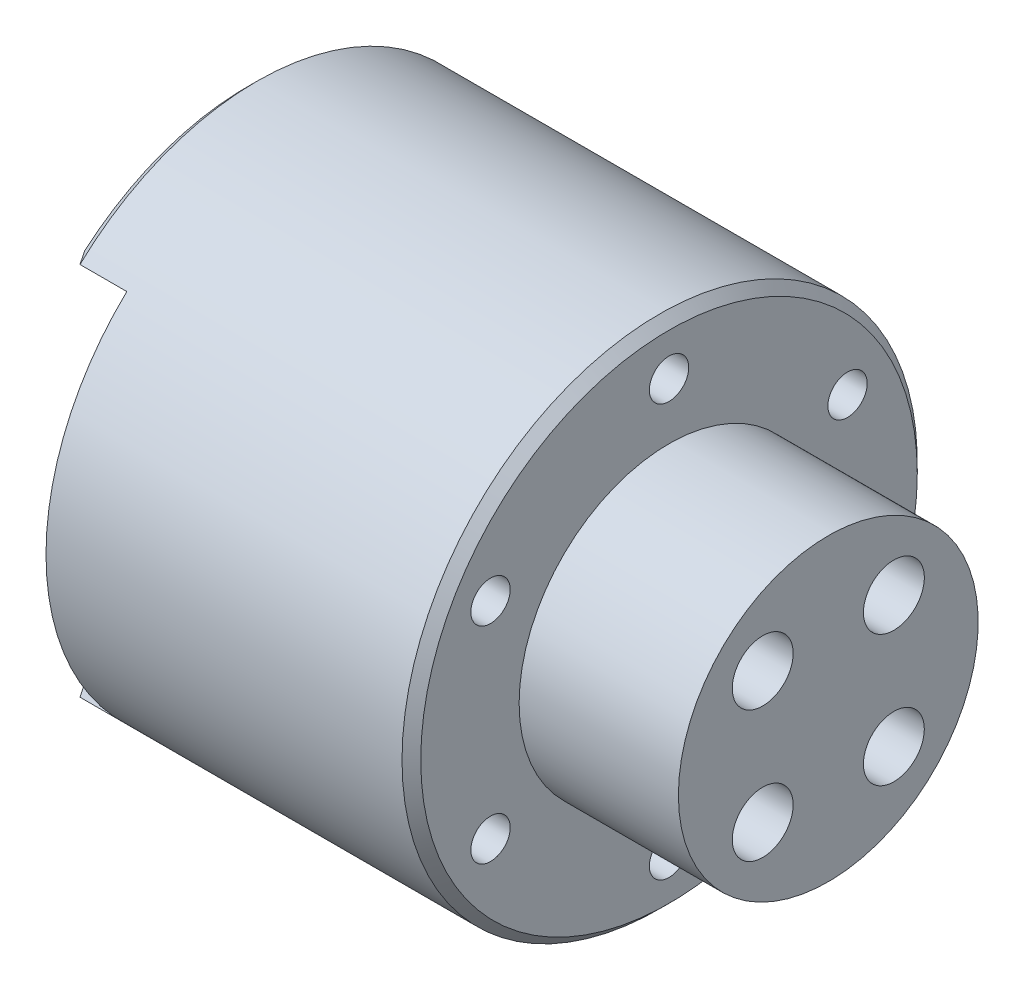
ISO-10303-21;
HEADER;
FILE_DESCRIPTION(('STEP AP214'),'2;1');
FILE_NAME('part.step','',(''),(''),'','','');
FILE_SCHEMA(('AUTOMOTIVE_DESIGN { 1 0 10303 214 1 1 1 1 }'));
ENDSEC;
DATA;
#1=APPLICATION_CONTEXT('core data for automotive mechanical design processes');
#2=APPLICATION_PROTOCOL_DEFINITION('international standard','automotive_design',2000,#1);
#3=PRODUCT_CONTEXT('',#1,'mechanical');
#4=PRODUCT('Part','Part','',(#3));
#5=PRODUCT_RELATED_PRODUCT_CATEGORY('part','',(#4));
#6=PRODUCT_DEFINITION_FORMATION('','',#4);
#7=PRODUCT_DEFINITION_CONTEXT('part definition',#1,'design');
#8=PRODUCT_DEFINITION('design','',#6,#7);
#9=PRODUCT_DEFINITION_SHAPE('','',#8);
#10=(LENGTH_UNIT() NAMED_UNIT(*) SI_UNIT(.MILLI.,.METRE.));
#11=(NAMED_UNIT(*) PLANE_ANGLE_UNIT() SI_UNIT($,.RADIAN.));
#12=(NAMED_UNIT(*) SI_UNIT($,.STERADIAN.) SOLID_ANGLE_UNIT());
#13=UNCERTAINTY_MEASURE_WITH_UNIT(LENGTH_MEASURE(1.E-05),#10,'distance_accuracy_value','');
#14=(GEOMETRIC_REPRESENTATION_CONTEXT(3) GLOBAL_UNCERTAINTY_ASSIGNED_CONTEXT((#13)) GLOBAL_UNIT_ASSIGNED_CONTEXT((#10,
#11,#12)) REPRESENTATION_CONTEXT('',''));
#15=CARTESIAN_POINT('',(0.,0.,0.));
#16=DIRECTION('',(0.,0.,1.));
#17=DIRECTION('',(1.,0.,0.));
#18=AXIS2_PLACEMENT_3D('',#15,#16,#17);
#19=CARTESIAN_POINT('',(0.,0.,0.));
#20=DIRECTION('',(1.,0.,0.));
#21=DIRECTION('',(0.,0.,-1.));
#22=AXIS2_PLACEMENT_3D('',#19,#20,#21);
#23=PLANE('',#22);
#24=CARTESIAN_POINT('',(0.,0.,0.));
#25=DIRECTION('',(1.,0.,0.));
#26=DIRECTION('',(0.,0.,-1.));
#27=AXIS2_PLACEMENT_3D('',#24,#25,#26);
#28=CIRCLE('',#27,26.5);
#29=CARTESIAN_POINT('',(0.,20.,17.3853386507137));
#30=VERTEX_POINT('',#29);
#31=CARTESIAN_POINT('',(0.,20.,-17.3853386507137));
#32=VERTEX_POINT('',#31);
#33=EDGE_CURVE('E191',#30,#32,#28,.F.);
#34=ORIENTED_EDGE('',*,*,#33,.T.);
#35=DIRECTION('',(0.,0.,-1.));
#36=VECTOR('',#35,1.);
#37=CARTESIAN_POINT('',(0.,20.,-18.8745860881769));
#38=LINE('',#37,#36);
#39=EDGE_CURVE('E115',#30,#32,#38,.T.);
#40=ORIENTED_EDGE('',*,*,#39,.F.);
#41=EDGE_LOOP('',(#34,#40));
#42=FACE_BOUND('',#41,.T.);
#43=ADVANCED_FACE('F44',(#42),#23,.F.);
#44=CARTESIAN_POINT('',(62.,7.,-7.));
#45=DIRECTION('',(-1.,0.,0.));
#46=DIRECTION('',(0.,0.,1.));
#47=AXIS2_PLACEMENT_3D('',#44,#45,#46);
#48=CYLINDRICAL_SURFACE('',#47,3.25);
#49=CARTESIAN_POINT('',(62.,7.,-7.));
#50=DIRECTION('',(-1.,0.,0.));
#51=DIRECTION('',(0.,0.,1.));
#52=AXIS2_PLACEMENT_3D('',#49,#50,#51);
#53=CIRCLE('',#52,3.25);
#54=CARTESIAN_POINT('',(62.,7.,-3.75));
#55=VERTEX_POINT('',#54);
#56=EDGE_CURVE('E177',#55,#55,#53,.T.);
#57=ORIENTED_EDGE('',*,*,#56,.F.);
#58=EDGE_LOOP('',(#57));
#59=FACE_BOUND('',#58,.T.);
#60=CARTESIAN_POINT('',(6.,7.,-7.));
#61=DIRECTION('',(-1.,0.,0.));
#62=DIRECTION('',(0.,0.,1.));
#63=AXIS2_PLACEMENT_3D('',#60,#61,#62);
#64=CIRCLE('',#63,3.25);
#65=CARTESIAN_POINT('',(6.,7.,-3.75));
#66=VERTEX_POINT('',#65);
#67=EDGE_CURVE('E134',#66,#66,#64,.F.);
#68=ORIENTED_EDGE('',*,*,#67,.F.);
#69=EDGE_LOOP('',(#68));
#70=FACE_BOUND('',#69,.T.);
#71=ADVANCED_FACE('F279',(#59,#70),#48,.F.);
#72=CARTESIAN_POINT('',(62.,7.,7.));
#73=DIRECTION('',(-1.,0.,0.));
#74=DIRECTION('',(0.,0.,1.));
#75=AXIS2_PLACEMENT_3D('',#72,#73,#74);
#76=CYLINDRICAL_SURFACE('',#75,3.25);
#77=CARTESIAN_POINT('',(62.,7.,7.));
#78=DIRECTION('',(-1.,0.,0.));
#79=DIRECTION('',(0.,0.,-1.));
#80=AXIS2_PLACEMENT_3D('',#77,#78,#79);
#81=CIRCLE('',#80,3.25);
#82=CARTESIAN_POINT('',(62.,7.,3.75));
#83=VERTEX_POINT('',#82);
#84=EDGE_CURVE('E174',#83,#83,#81,.T.);
#85=ORIENTED_EDGE('',*,*,#84,.F.);
#86=EDGE_LOOP('',(#85));
#87=FACE_BOUND('',#86,.T.);
#88=CARTESIAN_POINT('',(6.,7.,7.));
#89=DIRECTION('',(-1.,0.,0.));
#90=DIRECTION('',(0.,0.,1.));
#91=AXIS2_PLACEMENT_3D('',#88,#89,#90);
#92=CIRCLE('',#91,3.25);
#93=CARTESIAN_POINT('',(6.,7.,10.25));
#94=VERTEX_POINT('',#93);
#95=EDGE_CURVE('E131',#94,#94,#92,.F.);
#96=ORIENTED_EDGE('',*,*,#95,.F.);
#97=EDGE_LOOP('',(#96));
#98=FACE_BOUND('',#97,.T.);
#99=ADVANCED_FACE('F275',(#87,#98),#76,.F.);
#100=CARTESIAN_POINT('',(62.,-7.,7.));
#101=DIRECTION('',(-1.,0.,0.));
#102=DIRECTION('',(0.,0.,1.));
#103=AXIS2_PLACEMENT_3D('',#100,#101,#102);
#104=CYLINDRICAL_SURFACE('',#103,3.25);
#105=CARTESIAN_POINT('',(62.,-7.,7.));
#106=DIRECTION('',(-1.,0.,0.));
#107=DIRECTION('',(0.,0.,1.));
#108=AXIS2_PLACEMENT_3D('',#105,#106,#107);
#109=CIRCLE('',#108,3.25);
#110=CARTESIAN_POINT('',(62.,-7.,10.25));
#111=VERTEX_POINT('',#110);
#112=EDGE_CURVE('E178',#111,#111,#109,.T.);
#113=ORIENTED_EDGE('',*,*,#112,.F.);
#114=EDGE_LOOP('',(#113));
#115=FACE_BOUND('',#114,.T.);
#116=CARTESIAN_POINT('',(6.,-7.,7.));
#117=DIRECTION('',(-1.,0.,0.));
#118=DIRECTION('',(0.,0.,1.));
#119=AXIS2_PLACEMENT_3D('',#116,#117,#118);
#120=CIRCLE('',#119,3.25);
#121=CARTESIAN_POINT('',(6.,-7.,10.25));
#122=VERTEX_POINT('',#121);
#123=EDGE_CURVE('E128',#122,#122,#120,.F.);
#124=ORIENTED_EDGE('',*,*,#123,.F.);
#125=EDGE_LOOP('',(#124));
#126=FACE_BOUND('',#125,.T.);
#127=ADVANCED_FACE('F278',(#115,#126),#104,.F.);
#128=CARTESIAN_POINT('',(62.,-7.,-7.));
#129=DIRECTION('',(-1.,0.,0.));
#130=DIRECTION('',(0.,0.,1.));
#131=AXIS2_PLACEMENT_3D('',#128,#129,#130);
#132=CYLINDRICAL_SURFACE('',#131,3.25);
#133=CARTESIAN_POINT('',(62.,-7.,-7.));
#134=DIRECTION('',(-1.,0.,0.));
#135=DIRECTION('',(0.,0.,-1.));
#136=AXIS2_PLACEMENT_3D('',#133,#134,#135);
#137=CIRCLE('',#136,3.25);
#138=CARTESIAN_POINT('',(62.,-7.,-10.25));
#139=VERTEX_POINT('',#138);
#140=EDGE_CURVE('E171',#139,#139,#137,.T.);
#141=ORIENTED_EDGE('',*,*,#140,.F.);
#142=EDGE_LOOP('',(#141));
#143=FACE_BOUND('',#142,.T.);
#144=CARTESIAN_POINT('',(6.,-7.,-7.));
#145=DIRECTION('',(-1.,0.,0.));
#146=DIRECTION('',(0.,0.,1.));
#147=AXIS2_PLACEMENT_3D('',#144,#145,#146);
#148=CIRCLE('',#147,3.25);
#149=CARTESIAN_POINT('',(6.,-7.,-3.75));
#150=VERTEX_POINT('',#149);
#151=EDGE_CURVE('E49',#150,#150,#148,.F.);
#152=ORIENTED_EDGE('',*,*,#151,.F.);
#153=EDGE_LOOP('',(#152));
#154=FACE_BOUND('',#153,.T.);
#155=ADVANCED_FACE('F283',(#143,#154),#132,.F.);
#156=CARTESIAN_POINT('',(0.,0.,0.));
#157=DIRECTION('',(1.,0.,0.));
#158=DIRECTION('',(0.,0.,-1.));
#159=AXIS2_PLACEMENT_3D('',#156,#157,#158);
#160=CONICAL_SURFACE('',#159,26.5,0.785398163397448);
#161=CARTESIAN_POINT('',(1.00048044872167,20.,18.8752860881769));
#162=CARTESIAN_POINT('',(0.810645404918592,20.,18.5986967911016));
#163=CARTESIAN_POINT('',(0.622303325385153,20.,18.3210839345306));
#164=CARTESIAN_POINT('',(0.248907193370471,20.,17.7636402955611));
#165=CARTESIAN_POINT('',(0.0638532739791997,20.,17.4838094240473));
#166=CARTESIAN_POINT('',(-0.486083635139197,20.,16.6404859186058));
#167=CARTESIAN_POINT('',(-0.845551143544351,20.,16.0734389179388));
#168=CARTESIAN_POINT('',(-1.55169336680336,20.,14.9207363731394));
#169=CARTESIAN_POINT('',(-1.89812687730353,20.,14.3349325307337));
#170=CARTESIAN_POINT('',(-2.56875489654499,20.,13.1507649289391));
#171=CARTESIAN_POINT('',(-2.8929523721089,20.,12.5524028590879));
#172=CARTESIAN_POINT('',(-3.51977568156539,20.,11.3301013023612));
#173=CARTESIAN_POINT('',(-3.82187977308349,20.,10.705892299629));
#174=CARTESIAN_POINT('',(-4.39074912073094,20.,9.44128146220551));
#175=CARTESIAN_POINT('',(-4.65750813523416,20.,8.80087679121836));
#176=CARTESIAN_POINT('',(-5.14591890294825,20.,7.50691052301442));
#177=CARTESIAN_POINT('',(-5.36780818260502,20.,6.85343946914424));
#178=CARTESIAN_POINT('',(-5.75887969252395,20.,5.53099711855797));
#179=CARTESIAN_POINT('',(-5.92809533578745,20.,4.86203593842614));
#180=CARTESIAN_POINT('',(-6.13292313697697,20.,3.86249847285681));
#181=CARTESIAN_POINT('',(-6.19227243134055,20.,3.53668681663797));
#182=CARTESIAN_POINT('',(-6.29589712089843,20.,2.88269058747112));
#183=CARTESIAN_POINT('',(-6.34017454311901,20.,2.55450633968237));
#184=CARTESIAN_POINT('',(-6.41297202215523,20.,1.89624769901981));
#185=CARTESIAN_POINT('',(-6.44148524744739,20.,1.56617254921538));
#186=CARTESIAN_POINT('',(-6.4822532916096,20.,0.90500787427641));
#187=CARTESIAN_POINT('',(-6.49450784944087,20.,0.573918332940981));
#188=CARTESIAN_POINT('',(-6.50249807647048,20.,-0.0844792268072168));
#189=CARTESIAN_POINT('',(-6.49843052584999,20.,-0.411784864802713));
#190=CARTESIAN_POINT('',(-6.47428814234015,20.,-1.06579789625738));
#191=CARTESIAN_POINT('',(-6.45421353089501,20.,-1.39250529792998));
#192=CARTESIAN_POINT('',(-6.39838907450954,20.,-2.04457450393271));
#193=CARTESIAN_POINT('',(-6.36263916819602,20.,-2.3699363029894));
#194=CARTESIAN_POINT('',(-6.27603227622328,20.,-3.01864818419774));
#195=CARTESIAN_POINT('',(-6.22517437089313,20.,-3.34199814265869));
#196=CARTESIAN_POINT('',(-6.09597813407813,20.,-4.05893041670913));
#197=CARTESIAN_POINT('',(-6.01402652478261,20.,-4.45186441096859));
#198=CARTESIAN_POINT('',(-5.83020847837886,20.,-5.23302033240672));
#199=CARTESIAN_POINT('',(-5.72834050347915,20.,-5.62124189326691));
#200=CARTESIAN_POINT('',(-5.39550225650538,20.,-6.77830814454339));
#201=CARTESIAN_POINT('',(-5.13732552557375,20.,-7.53940665103709));
#202=CARTESIAN_POINT('',(-4.55970498051505,20.,-9.04815685625068));
#203=CARTESIAN_POINT('',(-4.23954847955722,20.,-9.79552908875287));
#204=CARTESIAN_POINT('',(-3.55322991876948,20.,-11.2684896421862));
#205=CARTESIAN_POINT('',(-3.18707527374219,20.,-11.9940814507718));
#206=CARTESIAN_POINT('',(-2.51470479060521,20.,-13.2476393746361));
#207=CARTESIAN_POINT('',(-2.21626454500624,20.,-13.7798290080722));
#208=CARTESIAN_POINT('',(-1.60268100388118,20.,-14.8344352133612));
#209=CARTESIAN_POINT('',(-1.28753857973691,20.,-15.3568522931451));
#210=CARTESIAN_POINT('',(-0.649728620482031,20.,-16.3827561959331));
#211=CARTESIAN_POINT('',(-0.327333608324186,20.,-16.8864130316215));
#212=CARTESIAN_POINT('',(0.164650016672057,20.,-17.6363001220891));
#213=CARTESIAN_POINT('',(0.330027682285184,20.,-17.8853071073708));
#214=CARTESIAN_POINT('',(0.663368272393422,20.,-18.3815759503305));
#215=CARTESIAN_POINT('',(0.831331131216373,20.,-18.6288378521072));
#216=CARTESIAN_POINT('',(1.00048044872166,20.,-18.8752860881769));
#217=B_SPLINE_CURVE_WITH_KNOTS('',3,(#161,#162,#163,#164,#165,#166,#167,#168,#169,#170,#171,
#172,#173,#174,#175,#176,#177,#178,#179,#180,#181,#182,#183,#184,#185,#186,#187,#188,#189,#190,
#191,#192,#193,#194,#195,#196,#197,#198,#199,#200,#201,#202,#203,#204,#205,#206,#207,#208,#209,
#210,#211,#212,#213,#214,#215,#216),.UNSPECIFIED.,.F.,.F.,(4,2,2,2,2,2,2,2,2,2,2,2,2,2,2,2,2,2,
2,2,2,2,2,2,2,2,2,4),(0.,1.00639589164065,2.01283242530694,4.02671281839027,6.06804755504067,
8.10910939650005,10.1886405589676,12.2685384600898,14.3371198782423,16.4043864255041,
17.3976142781071,18.3907084979975,19.3842327454608,20.3777729441224,21.3593711764219,
22.3409558293714,23.3225443255342,24.3041925862929,25.5077633027697,26.711426986622,
29.1192034963619,31.5565150509502,33.9934342190533,35.8235923434605,37.6536550791369,
39.4474846475128,40.3442366308418,41.2409658712831),.UNSPECIFIED.);
#218=CARTESIAN_POINT('',(0.999999999999984,20.,18.8745860881769));
#219=VERTEX_POINT('',#218);
#220=EDGE_CURVE('E11',#219,#30,#217,.T.);
#221=ORIENTED_EDGE('',*,*,#220,.F.);
#222=CARTESIAN_POINT('',(0.999999999999984,0.,0.));
#223=DIRECTION('',(1.,0.,0.));
#224=DIRECTION('',(0.,0.,-1.));
#225=AXIS2_PLACEMENT_3D('',#222,#223,#224);
#226=CIRCLE('',#225,27.5);
#227=CARTESIAN_POINT('',(0.999999999999984,20.,-18.8745860881769));
#228=VERTEX_POINT('',#227);
#229=EDGE_CURVE('E198',#228,#219,#226,.T.);
#230=ORIENTED_EDGE('',*,*,#229,.F.);
#231=EDGE_CURVE('E54',#32,#228,#217,.T.);
#232=ORIENTED_EDGE('',*,*,#231,.F.);
#233=ORIENTED_EDGE('',*,*,#33,.F.);
#234=EDGE_LOOP('',(#221,#230,#232,#233));
#235=FACE_BOUND('',#234,.T.);
#236=ADVANCED_FACE('F287',(#235),#160,.T.);
#237=CARTESIAN_POINT('',(0.,-20.,-17.3853386507137));
#238=VERTEX_POINT('',#237);
#239=CARTESIAN_POINT('',(0.,-20.,17.3853386507137));
#240=VERTEX_POINT('',#239);
#241=EDGE_CURVE('E192',#238,#240,#28,.F.);
#242=ORIENTED_EDGE('',*,*,#241,.T.);
#243=DIRECTION('',(0.,0.,1.));
#244=VECTOR('',#243,1.);
#245=CARTESIAN_POINT('',(0.,-20.,-18.8745860881769));
#246=LINE('',#245,#244);
#247=EDGE_CURVE('E61',#238,#240,#246,.T.);
#248=ORIENTED_EDGE('',*,*,#247,.F.);
#249=EDGE_LOOP('',(#242,#248));
#250=FACE_BOUND('',#249,.T.);
#251=ADVANCED_FACE('F304',(#250),#23,.F.);
#252=CARTESIAN_POINT('',(0.,0.,0.));
#253=DIRECTION('',(-1.,0.,0.));
#254=DIRECTION('',(0.,0.,1.));
#255=AXIS2_PLACEMENT_3D('',#252,#253,#254);
#256=CYLINDRICAL_SURFACE('',#255,27.5);
#257=CARTESIAN_POINT('',(6.,0.,0.));
#258=DIRECTION('',(-1.,0.,0.));
#259=DIRECTION('',(0.,0.,1.));
#260=AXIS2_PLACEMENT_3D('',#257,#258,#259);
#261=CIRCLE('',#260,27.5);
#262=CARTESIAN_POINT('',(6.,20.,-18.8745860881769));
#263=VERTEX_POINT('',#262);
#264=CARTESIAN_POINT('',(6.,-20.,-18.8745860881769));
#265=VERTEX_POINT('',#264);
#266=EDGE_CURVE('E106',#263,#265,#261,.T.);
#267=ORIENTED_EDGE('',*,*,#266,.F.);
#268=DIRECTION('',(-1.,0.,0.));
#269=VECTOR('',#268,1.);
#270=CARTESIAN_POINT('',(6.,20.,-18.8745860881769));
#271=LINE('',#270,#269);
#272=EDGE_CURVE('E327',#263,#228,#271,.T.);
#273=ORIENTED_EDGE('',*,*,#272,.T.);
#274=ORIENTED_EDGE('',*,*,#229,.T.);
#275=DIRECTION('',(-1.,0.,0.));
#276=VECTOR('',#275,1.);
#277=CARTESIAN_POINT('',(6.,20.,18.8745860881769));
#278=LINE('',#277,#276);
#279=CARTESIAN_POINT('',(6.,20.,18.8745860881769));
#280=VERTEX_POINT('',#279);
#281=EDGE_CURVE('E123',#280,#219,#278,.T.);
#282=ORIENTED_EDGE('',*,*,#281,.F.);
#283=CARTESIAN_POINT('',(6.,0.,0.));
#284=DIRECTION('',(-1.,0.,0.));
#285=DIRECTION('',(0.,0.,1.));
#286=AXIS2_PLACEMENT_3D('',#283,#284,#285);
#287=CIRCLE('',#286,27.5);
#288=CARTESIAN_POINT('',(6.,-20.,18.8745860881769));
#289=VERTEX_POINT('',#288);
#290=EDGE_CURVE('E105',#289,#280,#287,.T.);
#291=ORIENTED_EDGE('',*,*,#290,.F.);
#292=DIRECTION('',(-1.,0.,0.));
#293=VECTOR('',#292,1.);
#294=CARTESIAN_POINT('',(6.,-20.,18.8745860881769));
#295=LINE('',#294,#293);
#296=CARTESIAN_POINT('',(0.999999999999982,-20.,18.8745860881769));
#297=VERTEX_POINT('',#296);
#298=EDGE_CURVE('E102',#289,#297,#295,.T.);
#299=ORIENTED_EDGE('',*,*,#298,.T.);
#300=CARTESIAN_POINT('',(0.999999999999984,-20.,-18.8745860881769));
#301=VERTEX_POINT('',#300);
#302=EDGE_CURVE('E121',#297,#301,#226,.T.);
#303=ORIENTED_EDGE('',*,*,#302,.T.);
#304=DIRECTION('',(-1.,0.,0.));
#305=VECTOR('',#304,1.);
#306=CARTESIAN_POINT('',(6.,-20.,-18.8745860881769));
#307=LINE('',#306,#305);
#308=EDGE_CURVE('E99',#265,#301,#307,.T.);
#309=ORIENTED_EDGE('',*,*,#308,.F.);
#310=EDGE_LOOP('',(#267,#273,#274,#282,#291,#299,#303,#309));
#311=FACE_BOUND('',#310,.T.);
#312=CARTESIAN_POINT('',(44.,0.,0.));
#313=DIRECTION('',(-1.,0.,0.));
#314=DIRECTION('',(0.,0.,1.));
#315=AXIS2_PLACEMENT_3D('',#312,#313,#314);
#316=CIRCLE('',#315,27.5);
#317=CARTESIAN_POINT('',(44.,0.,27.5));
#318=VERTEX_POINT('',#317);
#319=EDGE_CURVE('E195',#318,#318,#316,.T.);
#320=ORIENTED_EDGE('',*,*,#319,.T.);
#321=EDGE_LOOP('',(#320));
#322=FACE_BOUND('',#321,.T.);
#323=ADVANCED_FACE('F118',(#311,#322),#256,.T.);
#324=CARTESIAN_POINT('',(45.,27.5,0.));
#325=DIRECTION('',(-1.,0.,0.));
#326=DIRECTION('',(0.,0.,1.));
#327=AXIS2_PLACEMENT_3D('',#324,#325,#326);
#328=PLANE('',#327);
#329=CARTESIAN_POINT('',(45.,0.,0.));
#330=DIRECTION('',(-1.,0.,0.));
#331=DIRECTION('',(0.,0.,1.));
#332=AXIS2_PLACEMENT_3D('',#329,#330,#331);
#333=CIRCLE('',#332,26.5);
#334=CARTESIAN_POINT('',(45.,0.,26.5));
#335=VERTEX_POINT('',#334);
#336=EDGE_CURVE('E201',#335,#335,#333,.F.);
#337=ORIENTED_EDGE('',*,*,#336,.T.);
#338=EDGE_LOOP('',(#337));
#339=FACE_BOUND('',#338,.T.);
#340=CARTESIAN_POINT('',(45.,11.0000000000002,-19.0525588832575));
#341=DIRECTION('',(1.,0.,0.));
#342=DIRECTION('',(0.,-0.866025403784433,-0.50000000000001));
#343=AXIS2_PLACEMENT_3D('',#340,#341,#342);
#344=CIRCLE('',#343,2.1);
#345=CARTESIAN_POINT('',(45.,9.18134665205291,-20.1025588832575));
#346=VERTEX_POINT('',#345);
#347=EDGE_CURVE('E137',#346,#346,#344,.T.);
#348=ORIENTED_EDGE('',*,*,#347,.F.);
#349=EDGE_LOOP('',(#348));
#350=FACE_BOUND('',#349,.T.);
#351=CARTESIAN_POINT('',(45.,-10.9999999999998,-19.0525588832577));
#352=DIRECTION('',(1.,0.,0.));
#353=DIRECTION('',(0.,-0.866025403784443,0.499999999999992));
#354=AXIS2_PLACEMENT_3D('',#351,#352,#353);
#355=CIRCLE('',#354,2.1);
#356=CARTESIAN_POINT('',(45.,-12.8186533479472,-18.0025588832578));
#357=VERTEX_POINT('',#356);
#358=EDGE_CURVE('E154',#357,#357,#355,.T.);
#359=ORIENTED_EDGE('',*,*,#358,.F.);
#360=EDGE_LOOP('',(#359));
#361=FACE_BOUND('',#360,.T.);
#362=CARTESIAN_POINT('',(45.,-22.,0.));
#363=DIRECTION('',(1.,0.,0.));
#364=DIRECTION('',(0.,0.,1.));
#365=AXIS2_PLACEMENT_3D('',#362,#363,#364);
#366=CIRCLE('',#365,2.1);
#367=CARTESIAN_POINT('',(45.,-22.,2.1));
#368=VERTEX_POINT('',#367);
#369=EDGE_CURVE('E148',#368,#368,#366,.T.);
#370=ORIENTED_EDGE('',*,*,#369,.F.);
#371=EDGE_LOOP('',(#370));
#372=FACE_BOUND('',#371,.T.);
#373=CARTESIAN_POINT('',(45.,-11.0000000000001,19.0525588832576));
#374=DIRECTION('',(1.,0.,0.));
#375=DIRECTION('',(0.,0.866025403784436,0.500000000000004));
#376=AXIS2_PLACEMENT_3D('',#373,#374,#375);
#377=CIRCLE('',#376,2.1);
#378=CARTESIAN_POINT('',(45.,-9.18134665205277,20.1025588832576));
#379=VERTEX_POINT('',#378);
#380=EDGE_CURVE('E142',#379,#379,#377,.T.);
#381=ORIENTED_EDGE('',*,*,#380,.F.);
#382=EDGE_LOOP('',(#381));
#383=FACE_BOUND('',#382,.T.);
#384=CARTESIAN_POINT('',(45.,11.,19.0525588832577));
#385=DIRECTION('',(1.,0.,0.));
#386=DIRECTION('',(0.,0.86602540378444,-0.499999999999998));
#387=AXIS2_PLACEMENT_3D('',#384,#385,#386);
#388=CIRCLE('',#387,2.1);
#389=CARTESIAN_POINT('',(45.,12.8186533479473,18.0025588832577));
#390=VERTEX_POINT('',#389);
#391=EDGE_CURVE('E141',#390,#390,#388,.T.);
#392=ORIENTED_EDGE('',*,*,#391,.F.);
#393=EDGE_LOOP('',(#392));
#394=FACE_BOUND('',#393,.T.);
#395=CARTESIAN_POINT('',(45.,22.,0.));
#396=DIRECTION('',(1.,0.,0.));
#397=DIRECTION('',(0.,0.,-1.));
#398=AXIS2_PLACEMENT_3D('',#395,#396,#397);
#399=CIRCLE('',#398,2.1);
#400=CARTESIAN_POINT('',(45.,22.,-2.1));
#401=VERTEX_POINT('',#400);
#402=EDGE_CURVE('E165',#401,#401,#399,.T.);
#403=ORIENTED_EDGE('',*,*,#402,.F.);
#404=EDGE_LOOP('',(#403));
#405=FACE_BOUND('',#404,.T.);
#406=CARTESIAN_POINT('',(45.,0.,0.));
#407=DIRECTION('',(-1.,0.,0.));
#408=DIRECTION('',(0.,0.,1.));
#409=AXIS2_PLACEMENT_3D('',#406,#407,#408);
#410=CIRCLE('',#409,16.);
#411=CARTESIAN_POINT('',(45.,0.,16.));
#412=VERTEX_POINT('',#411);
#413=EDGE_CURVE('E188',#412,#412,#410,.T.);
#414=ORIENTED_EDGE('',*,*,#413,.T.);
#415=EDGE_LOOP('',(#414));
#416=FACE_BOUND('',#415,.T.);
#417=ADVANCED_FACE('F298',(#339,#350,#361,#372,#383,#394,#405,#416),#328,.F.);
#418=CARTESIAN_POINT('',(0.,0.,0.));
#419=DIRECTION('',(-1.,0.,0.));
#420=DIRECTION('',(0.,0.,1.));
#421=AXIS2_PLACEMENT_3D('',#418,#419,#420);
#422=CYLINDRICAL_SURFACE('',#421,16.);
#423=ORIENTED_EDGE('',*,*,#413,.F.);
#424=EDGE_LOOP('',(#423));
#425=FACE_BOUND('',#424,.T.);
#426=CARTESIAN_POINT('',(62.,0.,0.));
#427=DIRECTION('',(-1.,0.,0.));
#428=DIRECTION('',(0.,0.,1.));
#429=AXIS2_PLACEMENT_3D('',#426,#427,#428);
#430=CIRCLE('',#429,16.);
#431=CARTESIAN_POINT('',(62.,0.,16.));
#432=VERTEX_POINT('',#431);
#433=EDGE_CURVE('E185',#432,#432,#430,.T.);
#434=ORIENTED_EDGE('',*,*,#433,.T.);
#435=EDGE_LOOP('',(#434));
#436=FACE_BOUND('',#435,.T.);
#437=ADVANCED_FACE('F294',(#425,#436),#422,.T.);
#438=CARTESIAN_POINT('',(62.,16.,0.));
#439=DIRECTION('',(-1.,0.,0.));
#440=DIRECTION('',(0.,0.,1.));
#441=AXIS2_PLACEMENT_3D('',#438,#439,#440);
#442=PLANE('',#441);
#443=ORIENTED_EDGE('',*,*,#140,.T.);
#444=EDGE_LOOP('',(#443));
#445=FACE_BOUND('',#444,.T.);
#446=ORIENTED_EDGE('',*,*,#112,.T.);
#447=EDGE_LOOP('',(#446));
#448=FACE_BOUND('',#447,.T.);
#449=ORIENTED_EDGE('',*,*,#84,.T.);
#450=EDGE_LOOP('',(#449));
#451=FACE_BOUND('',#450,.T.);
#452=ORIENTED_EDGE('',*,*,#56,.T.);
#453=EDGE_LOOP('',(#452));
#454=FACE_BOUND('',#453,.T.);
#455=ORIENTED_EDGE('',*,*,#433,.F.);
#456=EDGE_LOOP('',(#455));
#457=FACE_BOUND('',#456,.T.);
#458=ADVANCED_FACE('F273',(#445,#448,#451,#454,#457),#442,.F.);
#459=CARTESIAN_POINT('',(25.,22.,0.));
#460=DIRECTION('',(1.,0.,0.));
#461=DIRECTION('',(0.,0.,-1.));
#462=AXIS2_PLACEMENT_3D('',#459,#460,#461);
#463=CYLINDRICAL_SURFACE('',#462,2.1);
#464=CARTESIAN_POINT('',(25.,22.,0.));
#465=DIRECTION('',(1.,0.,0.));
#466=DIRECTION('',(0.,0.,-1.));
#467=AXIS2_PLACEMENT_3D('',#464,#465,#466);
#468=CIRCLE('',#467,2.1);
#469=CARTESIAN_POINT('',(25.,22.,-2.1));
#470=VERTEX_POINT('',#469);
#471=EDGE_CURVE('E168',#470,#470,#468,.T.);
#472=ORIENTED_EDGE('',*,*,#471,.F.);
#473=EDGE_LOOP('',(#472));
#474=FACE_BOUND('',#473,.T.);
#475=ORIENTED_EDGE('',*,*,#402,.T.);
#476=EDGE_LOOP('',(#475));
#477=FACE_BOUND('',#476,.T.);
#478=ADVANCED_FACE('F269',(#474,#477),#463,.F.);
#479=CARTESIAN_POINT('',(25.,22.,0.));
#480=DIRECTION('',(1.,0.,0.));
#481=DIRECTION('',(0.,0.,-1.));
#482=AXIS2_PLACEMENT_3D('',#479,#480,#481);
#483=PLANE('',#482);
#484=ORIENTED_EDGE('',*,*,#471,.T.);
#485=EDGE_LOOP('',(#484));
#486=FACE_BOUND('',#485,.T.);
#487=ADVANCED_FACE('F265',(#486),#483,.T.);
#488=CARTESIAN_POINT('',(25.,11.,19.0525588832577));
#489=DIRECTION('',(1.,0.,0.));
#490=DIRECTION('',(0.,0.,-1.));
#491=AXIS2_PLACEMENT_3D('',#488,#489,#490);
#492=CYLINDRICAL_SURFACE('',#491,2.1);
#493=CARTESIAN_POINT('',(25.,11.,19.0525588832577));
#494=DIRECTION('',(1.,0.,0.));
#495=DIRECTION('',(0.,0.86602540378444,-0.499999999999998));
#496=AXIS2_PLACEMENT_3D('',#493,#494,#495);
#497=CIRCLE('',#496,2.1);
#498=CARTESIAN_POINT('',(25.,12.8186533479473,18.0025588832577));
#499=VERTEX_POINT('',#498);
#500=EDGE_CURVE('E162',#499,#499,#497,.T.);
#501=ORIENTED_EDGE('',*,*,#500,.F.);
#502=EDGE_LOOP('',(#501));
#503=FACE_BOUND('',#502,.T.);
#504=ORIENTED_EDGE('',*,*,#391,.T.);
#505=EDGE_LOOP('',(#504));
#506=FACE_BOUND('',#505,.T.);
#507=ADVANCED_FACE('F261',(#503,#506),#492,.F.);
#508=CARTESIAN_POINT('',(25.,11.,19.0525588832577));
#509=DIRECTION('',(1.,0.,0.));
#510=DIRECTION('',(0.,0.86602540378444,-0.499999999999998));
#511=AXIS2_PLACEMENT_3D('',#508,#509,#510);
#512=PLANE('',#511);
#513=ORIENTED_EDGE('',*,*,#500,.T.);
#514=EDGE_LOOP('',(#513));
#515=FACE_BOUND('',#514,.T.);
#516=ADVANCED_FACE('F234',(#515),#512,.T.);
#517=CARTESIAN_POINT('',(25.,-11.0000000000001,19.0525588832576));
#518=DIRECTION('',(1.,0.,0.));
#519=DIRECTION('',(0.,0.,-1.));
#520=AXIS2_PLACEMENT_3D('',#517,#518,#519);
#521=CYLINDRICAL_SURFACE('',#520,2.1);
#522=CARTESIAN_POINT('',(25.,-11.0000000000001,19.0525588832576));
#523=DIRECTION('',(1.,0.,0.));
#524=DIRECTION('',(0.,0.866025403784436,0.500000000000004));
#525=AXIS2_PLACEMENT_3D('',#522,#523,#524);
#526=CIRCLE('',#525,2.1);
#527=CARTESIAN_POINT('',(25.,-9.18134665205277,20.1025588832576));
#528=VERTEX_POINT('',#527);
#529=EDGE_CURVE('E138',#528,#528,#526,.T.);
#530=ORIENTED_EDGE('',*,*,#529,.F.);
#531=EDGE_LOOP('',(#530));
#532=FACE_BOUND('',#531,.T.);
#533=ORIENTED_EDGE('',*,*,#380,.T.);
#534=EDGE_LOOP('',(#533));
#535=FACE_BOUND('',#534,.T.);
#536=ADVANCED_FACE('F230',(#532,#535),#521,.F.);
#537=CARTESIAN_POINT('',(25.,-11.0000000000001,19.0525588832576));
#538=DIRECTION('',(1.,0.,0.));
#539=DIRECTION('',(0.,0.866025403784436,0.500000000000004));
#540=AXIS2_PLACEMENT_3D('',#537,#538,#539);
#541=PLANE('',#540);
#542=ORIENTED_EDGE('',*,*,#529,.T.);
#543=EDGE_LOOP('',(#542));
#544=FACE_BOUND('',#543,.T.);
#545=ADVANCED_FACE('F226',(#544),#541,.T.);
#546=CARTESIAN_POINT('',(25.,-22.,0.));
#547=DIRECTION('',(1.,0.,0.));
#548=DIRECTION('',(0.,0.,-1.));
#549=AXIS2_PLACEMENT_3D('',#546,#547,#548);
#550=CYLINDRICAL_SURFACE('',#549,2.1);
#551=CARTESIAN_POINT('',(25.,-22.,0.));
#552=DIRECTION('',(1.,0.,0.));
#553=DIRECTION('',(0.,0.,1.));
#554=AXIS2_PLACEMENT_3D('',#551,#552,#553);
#555=CIRCLE('',#554,2.1);
#556=CARTESIAN_POINT('',(25.,-22.,2.1));
#557=VERTEX_POINT('',#556);
#558=EDGE_CURVE('E145',#557,#557,#555,.T.);
#559=ORIENTED_EDGE('',*,*,#558,.F.);
#560=EDGE_LOOP('',(#559));
#561=FACE_BOUND('',#560,.T.);
#562=ORIENTED_EDGE('',*,*,#369,.T.);
#563=EDGE_LOOP('',(#562));
#564=FACE_BOUND('',#563,.T.);
#565=ADVANCED_FACE('F229',(#561,#564),#550,.F.);
#566=CARTESIAN_POINT('',(25.,-22.,0.));
#567=DIRECTION('',(1.,0.,0.));
#568=DIRECTION('',(0.,0.,1.));
#569=AXIS2_PLACEMENT_3D('',#566,#567,#568);
#570=PLANE('',#569);
#571=ORIENTED_EDGE('',*,*,#558,.T.);
#572=EDGE_LOOP('',(#571));
#573=FACE_BOUND('',#572,.T.);
#574=ADVANCED_FACE('F236',(#573),#570,.T.);
#575=CARTESIAN_POINT('',(25.,-10.9999999999998,-19.0525588832577));
#576=DIRECTION('',(1.,0.,0.));
#577=DIRECTION('',(0.,0.,-1.));
#578=AXIS2_PLACEMENT_3D('',#575,#576,#577);
#579=CYLINDRICAL_SURFACE('',#578,2.1);
#580=CARTESIAN_POINT('',(25.,-10.9999999999998,-19.0525588832577));
#581=DIRECTION('',(1.,0.,0.));
#582=DIRECTION('',(0.,-0.866025403784443,0.499999999999992));
#583=AXIS2_PLACEMENT_3D('',#580,#581,#582);
#584=CIRCLE('',#583,2.1);
#585=CARTESIAN_POINT('',(25.,-12.8186533479472,-18.0025588832578));
#586=VERTEX_POINT('',#585);
#587=EDGE_CURVE('E151',#586,#586,#584,.T.);
#588=ORIENTED_EDGE('',*,*,#587,.F.);
#589=EDGE_LOOP('',(#588));
#590=FACE_BOUND('',#589,.T.);
#591=ORIENTED_EDGE('',*,*,#358,.T.);
#592=EDGE_LOOP('',(#591));
#593=FACE_BOUND('',#592,.T.);
#594=ADVANCED_FACE('F239',(#590,#593),#579,.F.);
#595=CARTESIAN_POINT('',(25.,-10.9999999999998,-19.0525588832577));
#596=DIRECTION('',(1.,0.,0.));
#597=DIRECTION('',(0.,-0.866025403784443,0.499999999999992));
#598=AXIS2_PLACEMENT_3D('',#595,#596,#597);
#599=PLANE('',#598);
#600=ORIENTED_EDGE('',*,*,#587,.T.);
#601=EDGE_LOOP('',(#600));
#602=FACE_BOUND('',#601,.T.);
#603=ADVANCED_FACE('F244',(#602),#599,.T.);
#604=CARTESIAN_POINT('',(25.,11.0000000000002,-19.0525588832575));
#605=DIRECTION('',(1.,0.,0.));
#606=DIRECTION('',(0.,0.,-1.));
#607=AXIS2_PLACEMENT_3D('',#604,#605,#606);
#608=CYLINDRICAL_SURFACE('',#607,2.1);
#609=CARTESIAN_POINT('',(25.,11.0000000000002,-19.0525588832575));
#610=DIRECTION('',(1.,0.,0.));
#611=DIRECTION('',(0.,-0.866025403784433,-0.50000000000001));
#612=AXIS2_PLACEMENT_3D('',#609,#610,#611);
#613=CIRCLE('',#612,2.1);
#614=CARTESIAN_POINT('',(25.,9.18134665205291,-20.1025588832575));
#615=VERTEX_POINT('',#614);
#616=EDGE_CURVE('E157',#615,#615,#613,.T.);
#617=ORIENTED_EDGE('',*,*,#616,.F.);
#618=EDGE_LOOP('',(#617));
#619=FACE_BOUND('',#618,.T.);
#620=ORIENTED_EDGE('',*,*,#347,.T.);
#621=EDGE_LOOP('',(#620));
#622=FACE_BOUND('',#621,.T.);
#623=ADVANCED_FACE('F247',(#619,#622),#608,.F.);
#624=CARTESIAN_POINT('',(25.,11.0000000000002,-19.0525588832575));
#625=DIRECTION('',(1.,0.,0.));
#626=DIRECTION('',(0.,-0.866025403784433,-0.50000000000001));
#627=AXIS2_PLACEMENT_3D('',#624,#625,#626);
#628=PLANE('',#627);
#629=ORIENTED_EDGE('',*,*,#616,.T.);
#630=EDGE_LOOP('',(#629));
#631=FACE_BOUND('',#630,.T.);
#632=ADVANCED_FACE('F252',(#631),#628,.T.);
#633=CARTESIAN_POINT('',(1.00048044872167,-20.,-18.8752860881769));
#634=CARTESIAN_POINT('',(0.810645404918592,-20.,-18.5986967911016));
#635=CARTESIAN_POINT('',(0.622303325385153,-20.,-18.3210839345306));
#636=CARTESIAN_POINT('',(0.248907193370471,-20.,-17.7636402955611));
#637=CARTESIAN_POINT('',(0.0638532739791997,-20.,-17.4838094240473));
#638=CARTESIAN_POINT('',(-0.486083635139197,-20.,-16.6404859186058));
#639=CARTESIAN_POINT('',(-0.845551143544351,-20.,-16.0734389179388));
#640=CARTESIAN_POINT('',(-1.55169336680336,-20.,-14.9207363731394));
#641=CARTESIAN_POINT('',(-1.89812687730353,-20.,-14.3349325307337));
#642=CARTESIAN_POINT('',(-2.56875489654499,-20.,-13.1507649289391));
#643=CARTESIAN_POINT('',(-2.8929523721089,-20.,-12.5524028590879));
#644=CARTESIAN_POINT('',(-3.51977568156539,-20.,-11.3301013023612));
#645=CARTESIAN_POINT('',(-3.82187977308349,-20.,-10.705892299629));
#646=CARTESIAN_POINT('',(-4.39074912073094,-20.,-9.44128146220551));
#647=CARTESIAN_POINT('',(-4.65750813523416,-20.,-8.80087679121836));
#648=CARTESIAN_POINT('',(-5.14591890294825,-20.,-7.50691052301442));
#649=CARTESIAN_POINT('',(-5.36780818260502,-20.,-6.85343946914424));
#650=CARTESIAN_POINT('',(-5.75887969252395,-20.,-5.53099711855797));
#651=CARTESIAN_POINT('',(-5.92809533578745,-20.,-4.86203593842614));
#652=CARTESIAN_POINT('',(-6.13292313697697,-20.,-3.86249847285681));
#653=CARTESIAN_POINT('',(-6.19227243134055,-20.,-3.53668681663797));
#654=CARTESIAN_POINT('',(-6.29589712089843,-20.,-2.88269058747112));
#655=CARTESIAN_POINT('',(-6.34017454311901,-20.,-2.55450633968237));
#656=CARTESIAN_POINT('',(-6.41297202215523,-20.,-1.89624769901981));
#657=CARTESIAN_POINT('',(-6.44148524744739,-20.,-1.56617254921538));
#658=CARTESIAN_POINT('',(-6.4822532916096,-20.,-0.90500787427641));
#659=CARTESIAN_POINT('',(-6.49450784944087,-20.,-0.573918332940981));
#660=CARTESIAN_POINT('',(-6.50249807647048,-20.,0.0844792268072167));
#661=CARTESIAN_POINT('',(-6.49843052584999,-20.,0.411784864802713));
#662=CARTESIAN_POINT('',(-6.47428814234015,-20.,1.06579789625738));
#663=CARTESIAN_POINT('',(-6.45421353089501,-20.,1.39250529792998));
#664=CARTESIAN_POINT('',(-6.39838907450954,-20.,2.04457450393271));
#665=CARTESIAN_POINT('',(-6.36263916819602,-20.,2.3699363029894));
#666=CARTESIAN_POINT('',(-6.27603227622328,-20.,3.01864818419774));
#667=CARTESIAN_POINT('',(-6.22517437089313,-20.,3.34199814265869));
#668=CARTESIAN_POINT('',(-6.09597813407813,-20.,4.05893041670913));
#669=CARTESIAN_POINT('',(-6.01402652478262,-20.,4.45186441096859));
#670=CARTESIAN_POINT('',(-5.83020847837886,-20.,5.23302033240672));
#671=CARTESIAN_POINT('',(-5.72834050347915,-20.,5.62124189326691));
#672=CARTESIAN_POINT('',(-5.39550225650537,-20.,6.77830814454339));
#673=CARTESIAN_POINT('',(-5.13732552557374,-20.,7.53940665103709));
#674=CARTESIAN_POINT('',(-4.55970498051505,-20.,9.04815685625069));
#675=CARTESIAN_POINT('',(-4.23954847955722,-20.,9.79552908875287));
#676=CARTESIAN_POINT('',(-3.55322991876948,-20.,11.2684896421862));
#677=CARTESIAN_POINT('',(-3.18707527374219,-20.,11.9940814507718));
#678=CARTESIAN_POINT('',(-2.51470479060521,-20.,13.2476393746361));
#679=CARTESIAN_POINT('',(-2.21626454500624,-20.,13.7798290080722));
#680=CARTESIAN_POINT('',(-1.60268100388118,-20.,14.8344352133612));
#681=CARTESIAN_POINT('',(-1.28753857973691,-20.,15.3568522931451));
#682=CARTESIAN_POINT('',(-0.649728620482038,-20.,16.3827561959331));
#683=CARTESIAN_POINT('',(-0.327333608324197,-20.,16.8864130316215));
#684=CARTESIAN_POINT('',(0.164650016672047,-20.,17.6363001220891));
#685=CARTESIAN_POINT('',(0.330027682285176,-20.,17.8853071073708));
#686=CARTESIAN_POINT('',(0.663368272393418,-20.,18.3815759503305));
#687=CARTESIAN_POINT('',(0.83133113121637,-20.,18.6288378521072));
#688=CARTESIAN_POINT('',(1.00048044872166,-20.,18.8752860881769));
#689=B_SPLINE_CURVE_WITH_KNOTS('',3,(#633,#634,#635,#636,#637,#638,#639,#640,#641,#642,#643,
#644,#645,#646,#647,#648,#649,#650,#651,#652,#653,#654,#655,#656,#657,#658,#659,#660,#661,#662,
#663,#664,#665,#666,#667,#668,#669,#670,#671,#672,#673,#674,#675,#676,#677,#678,#679,#680,#681,
#682,#683,#684,#685,#686,#687,#688),.UNSPECIFIED.,.F.,.F.,(4,2,2,2,2,2,2,2,2,2,2,2,2,2,2,2,2,2,
2,2,2,2,2,2,2,2,2,4),(0.,1.00639589164065,2.01283242530694,4.02671281839027,6.06804755504067,
8.10910939650005,10.1886405589676,12.2685384600898,14.3371198782423,16.4043864255041,
17.3976142781071,18.3907084979975,19.3842327454608,20.3777729441224,21.3593711764219,
22.3409558293714,23.3225443255342,24.3041925862929,25.5077633027697,26.711426986622,
29.1192034963619,31.5565150509502,33.9934342190533,35.8235923434605,37.6536550791369,
39.4474846475128,40.3442366308418,41.2409658712831),.UNSPECIFIED.);
#690=EDGE_CURVE('E210',#301,#238,#689,.T.);
#691=ORIENTED_EDGE('',*,*,#690,.F.);
#692=ORIENTED_EDGE('',*,*,#302,.F.);
#693=EDGE_CURVE('E204',#240,#297,#689,.T.);
#694=ORIENTED_EDGE('',*,*,#693,.F.);
#695=ORIENTED_EDGE('',*,*,#241,.F.);
#696=EDGE_LOOP('',(#691,#692,#694,#695));
#697=FACE_BOUND('',#696,.T.);
#698=ADVANCED_FACE('F217',(#697),#160,.T.);
#699=CARTESIAN_POINT('',(44.,0.,0.));
#700=DIRECTION('',(-1.,0.,0.));
#701=DIRECTION('',(0.,0.,1.));
#702=AXIS2_PLACEMENT_3D('',#699,#700,#701);
#703=CONICAL_SURFACE('',#702,27.5,0.785398163397455);
#704=ORIENTED_EDGE('',*,*,#336,.F.);
#705=EDGE_LOOP('',(#704));
#706=FACE_BOUND('',#705,.T.);
#707=ORIENTED_EDGE('',*,*,#319,.F.);
#708=EDGE_LOOP('',(#707));
#709=FACE_BOUND('',#708,.T.);
#710=ADVANCED_FACE('F47',(#706,#709),#703,.T.);
#711=CARTESIAN_POINT('',(6.,0.,0.));
#712=DIRECTION('',(-1.,0.,0.));
#713=DIRECTION('',(0.,0.,1.));
#714=AXIS2_PLACEMENT_3D('',#711,#712,#713);
#715=PLANE('',#714);
#716=ORIENTED_EDGE('',*,*,#266,.T.);
#717=DIRECTION('',(0.,0.,1.));
#718=VECTOR('',#717,1.);
#719=CARTESIAN_POINT('',(6.,-20.,-18.8745860881769));
#720=LINE('',#719,#718);
#721=EDGE_CURVE('E95',#265,#289,#720,.T.);
#722=ORIENTED_EDGE('',*,*,#721,.T.);
#723=ORIENTED_EDGE('',*,*,#290,.T.);
#724=DIRECTION('',(0.,0.,-1.));
#725=VECTOR('',#724,1.);
#726=CARTESIAN_POINT('',(6.,20.,-18.8745860881769));
#727=LINE('',#726,#725);
#728=EDGE_CURVE('E113',#280,#263,#727,.T.);
#729=ORIENTED_EDGE('',*,*,#728,.T.);
#730=EDGE_LOOP('',(#716,#722,#723,#729));
#731=FACE_BOUND('',#730,.T.);
#732=ORIENTED_EDGE('',*,*,#151,.T.);
#733=EDGE_LOOP('',(#732));
#734=FACE_BOUND('',#733,.T.);
#735=ORIENTED_EDGE('',*,*,#123,.T.);
#736=EDGE_LOOP('',(#735));
#737=FACE_BOUND('',#736,.T.);
#738=ORIENTED_EDGE('',*,*,#95,.T.);
#739=EDGE_LOOP('',(#738));
#740=FACE_BOUND('',#739,.T.);
#741=ORIENTED_EDGE('',*,*,#67,.T.);
#742=EDGE_LOOP('',(#741));
#743=FACE_BOUND('',#742,.T.);
#744=ADVANCED_FACE('F110',(#731,#734,#737,#740,#743),#715,.T.);
#745=CARTESIAN_POINT('',(6.,20.,-18.8745860881769));
#746=DIRECTION('',(0.,1.,0.));
#747=DIRECTION('',(0.,0.,1.));
#748=AXIS2_PLACEMENT_3D('',#745,#746,#747);
#749=PLANE('',#748);
#750=ORIENTED_EDGE('',*,*,#220,.T.);
#751=ORIENTED_EDGE('',*,*,#39,.T.);
#752=ORIENTED_EDGE('',*,*,#231,.T.);
#753=ORIENTED_EDGE('',*,*,#272,.F.);
#754=ORIENTED_EDGE('',*,*,#728,.F.);
#755=ORIENTED_EDGE('',*,*,#281,.T.);
#756=EDGE_LOOP('',(#750,#751,#752,#753,#754,#755));
#757=FACE_BOUND('',#756,.T.);
#758=ADVANCED_FACE('F223',(#757),#749,.F.);
#759=CARTESIAN_POINT('',(6.,-20.,-18.8745860881769));
#760=DIRECTION('',(0.,-1.,0.));
#761=DIRECTION('',(0.,0.,-1.));
#762=AXIS2_PLACEMENT_3D('',#759,#760,#761);
#763=PLANE('',#762);
#764=ORIENTED_EDGE('',*,*,#690,.T.);
#765=ORIENTED_EDGE('',*,*,#247,.T.);
#766=ORIENTED_EDGE('',*,*,#693,.T.);
#767=ORIENTED_EDGE('',*,*,#298,.F.);
#768=ORIENTED_EDGE('',*,*,#721,.F.);
#769=ORIENTED_EDGE('',*,*,#308,.T.);
#770=EDGE_LOOP('',(#764,#765,#766,#767,#768,#769));
#771=FACE_BOUND('',#770,.T.);
#772=ADVANCED_FACE('F97',(#771),#763,.F.);
#773=CLOSED_SHELL('',(#43,#71,#99,#127,#155,#236,#251,#323,#417,#437,#458,#478,#487,#507,#516,
#536,#545,#565,#574,#594,#603,#623,#632,#698,#710,#744,#758,#772));
#774=MANIFOLD_SOLID_BREP('B2',#773);
#775=ADVANCED_BREP_SHAPE_REPRESENTATION('',(#18,#774),#14);
#776=SHAPE_DEFINITION_REPRESENTATION(#9,#775);
ENDSEC;
END-ISO-10303-21;
